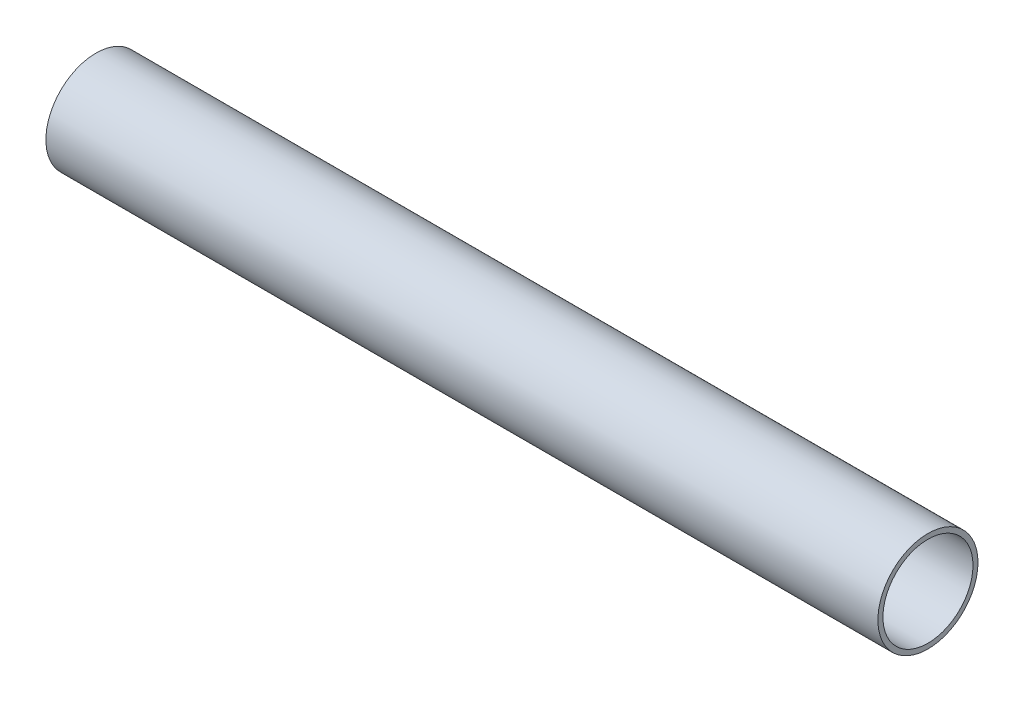
ISO-10303-21;
HEADER;
FILE_DESCRIPTION(('STEP AP214'),'2;1');
FILE_NAME('part.step','',(''),(''),'','','');
FILE_SCHEMA(('AUTOMOTIVE_DESIGN { 1 0 10303 214 1 1 1 1 }'));
ENDSEC;
DATA;
#1=APPLICATION_CONTEXT('core data for automotive mechanical design processes');
#2=APPLICATION_PROTOCOL_DEFINITION('international standard','automotive_design',2000,#1);
#3=PRODUCT_CONTEXT('',#1,'mechanical');
#4=PRODUCT('Part','Part','',(#3));
#5=PRODUCT_RELATED_PRODUCT_CATEGORY('part','',(#4));
#6=PRODUCT_DEFINITION_FORMATION('','',#4);
#7=PRODUCT_DEFINITION_CONTEXT('part definition',#1,'design');
#8=PRODUCT_DEFINITION('design','',#6,#7);
#9=PRODUCT_DEFINITION_SHAPE('','',#8);
#10=(LENGTH_UNIT() NAMED_UNIT(*) SI_UNIT(.MILLI.,.METRE.));
#11=(NAMED_UNIT(*) PLANE_ANGLE_UNIT() SI_UNIT($,.RADIAN.));
#12=(NAMED_UNIT(*) SI_UNIT($,.STERADIAN.) SOLID_ANGLE_UNIT());
#13=UNCERTAINTY_MEASURE_WITH_UNIT(LENGTH_MEASURE(1.E-05),#10,'distance_accuracy_value','');
#14=(GEOMETRIC_REPRESENTATION_CONTEXT(3) GLOBAL_UNCERTAINTY_ASSIGNED_CONTEXT((#13)) GLOBAL_UNIT_ASSIGNED_CONTEXT((#10,
#11,#12)) REPRESENTATION_CONTEXT('',''));
#15=CARTESIAN_POINT('',(0.,0.,0.));
#16=DIRECTION('',(0.,0.,1.));
#17=DIRECTION('',(1.,0.,0.));
#18=AXIS2_PLACEMENT_3D('',#15,#16,#17);
#19=CARTESIAN_POINT('',(131.9557559,0.,0.));
#20=DIRECTION('',(1.,0.,0.));
#21=DIRECTION('',(0.,0.,-1.));
#22=AXIS2_PLACEMENT_3D('',#19,#20,#21);
#23=PLANE('',#22);
#24=CARTESIAN_POINT('',(131.9557559,0.,0.));
#25=DIRECTION('',(1.,0.,0.));
#26=DIRECTION('',(0.,0.,-1.));
#27=AXIS2_PLACEMENT_3D('',#24,#25,#26);
#28=CIRCLE('',#27,15.875);
#29=CARTESIAN_POINT('',(131.9557559,0.,-15.875));
#30=VERTEX_POINT('',#29);
#31=EDGE_CURVE('E11',#30,#30,#28,.T.);
#32=ORIENTED_EDGE('',*,*,#31,.T.);
#33=EDGE_LOOP('',(#32));
#34=FACE_BOUND('',#33,.T.);
#35=CARTESIAN_POINT('',(131.9557559,0.,0.));
#36=DIRECTION('',(1.,0.,0.));
#37=DIRECTION('',(0.,0.,-1.));
#38=AXIS2_PLACEMENT_3D('',#35,#36,#37);
#39=CIRCLE('',#38,14.2875);
#40=CARTESIAN_POINT('',(131.9557559,0.,-14.2875));
#41=VERTEX_POINT('',#40);
#42=EDGE_CURVE('E52',#41,#41,#39,.T.);
#43=ORIENTED_EDGE('',*,*,#42,.F.);
#44=EDGE_LOOP('',(#43));
#45=FACE_BOUND('',#44,.T.);
#46=ADVANCED_FACE('F41',(#34,#45),#23,.T.);
#47=CARTESIAN_POINT('',(-131.9557559,0.,0.));
#48=DIRECTION('',(1.,0.,0.));
#49=DIRECTION('',(0.,0.,-1.));
#50=AXIS2_PLACEMENT_3D('',#47,#48,#49);
#51=PLANE('',#50);
#52=CARTESIAN_POINT('',(-131.9557559,0.,0.));
#53=DIRECTION('',(1.,0.,0.));
#54=DIRECTION('',(0.,0.,-1.));
#55=AXIS2_PLACEMENT_3D('',#52,#53,#54);
#56=CIRCLE('',#55,15.875);
#57=CARTESIAN_POINT('',(-131.9557559,0.,-15.875));
#58=VERTEX_POINT('',#57);
#59=EDGE_CURVE('E45',#58,#58,#56,.T.);
#60=ORIENTED_EDGE('',*,*,#59,.F.);
#61=EDGE_LOOP('',(#60));
#62=FACE_BOUND('',#61,.T.);
#63=CARTESIAN_POINT('',(-131.9557559,0.,0.));
#64=DIRECTION('',(1.,0.,0.));
#65=DIRECTION('',(0.,0.,-1.));
#66=AXIS2_PLACEMENT_3D('',#63,#64,#65);
#67=CIRCLE('',#66,14.2875);
#68=CARTESIAN_POINT('',(-131.9557559,0.,-14.2875));
#69=VERTEX_POINT('',#68);
#70=EDGE_CURVE('E54',#69,#69,#67,.T.);
#71=ORIENTED_EDGE('',*,*,#70,.T.);
#72=EDGE_LOOP('',(#71));
#73=FACE_BOUND('',#72,.T.);
#74=ADVANCED_FACE('F64',(#62,#73),#51,.F.);
#75=CARTESIAN_POINT('',(131.9557559,0.,0.));
#76=DIRECTION('',(-1.,0.,0.));
#77=DIRECTION('',(0.,0.,1.));
#78=AXIS2_PLACEMENT_3D('',#75,#76,#77);
#79=CYLINDRICAL_SURFACE('',#78,15.875);
#80=ORIENTED_EDGE('',*,*,#31,.F.);
#81=EDGE_LOOP('',(#80));
#82=FACE_BOUND('',#81,.T.);
#83=ORIENTED_EDGE('',*,*,#59,.T.);
#84=EDGE_LOOP('',(#83));
#85=FACE_BOUND('',#84,.T.);
#86=ADVANCED_FACE('F43',(#82,#85),#79,.T.);
#87=CARTESIAN_POINT('',(131.9557559,0.,0.));
#88=DIRECTION('',(-1.,0.,0.));
#89=DIRECTION('',(0.,0.,1.));
#90=AXIS2_PLACEMENT_3D('',#87,#88,#89);
#91=CYLINDRICAL_SURFACE('',#90,14.2875);
#92=ORIENTED_EDGE('',*,*,#42,.T.);
#93=EDGE_LOOP('',(#92));
#94=FACE_BOUND('',#93,.T.);
#95=ORIENTED_EDGE('',*,*,#70,.F.);
#96=EDGE_LOOP('',(#95));
#97=FACE_BOUND('',#96,.T.);
#98=ADVANCED_FACE('F60',(#94,#97),#91,.F.);
#99=CLOSED_SHELL('',(#46,#74,#86,#98));
#100=MANIFOLD_SOLID_BREP('B2',#99);
#101=ADVANCED_BREP_SHAPE_REPRESENTATION('',(#18,#100),#14);
#102=SHAPE_DEFINITION_REPRESENTATION(#9,#101);
ENDSEC;
END-ISO-10303-21;
